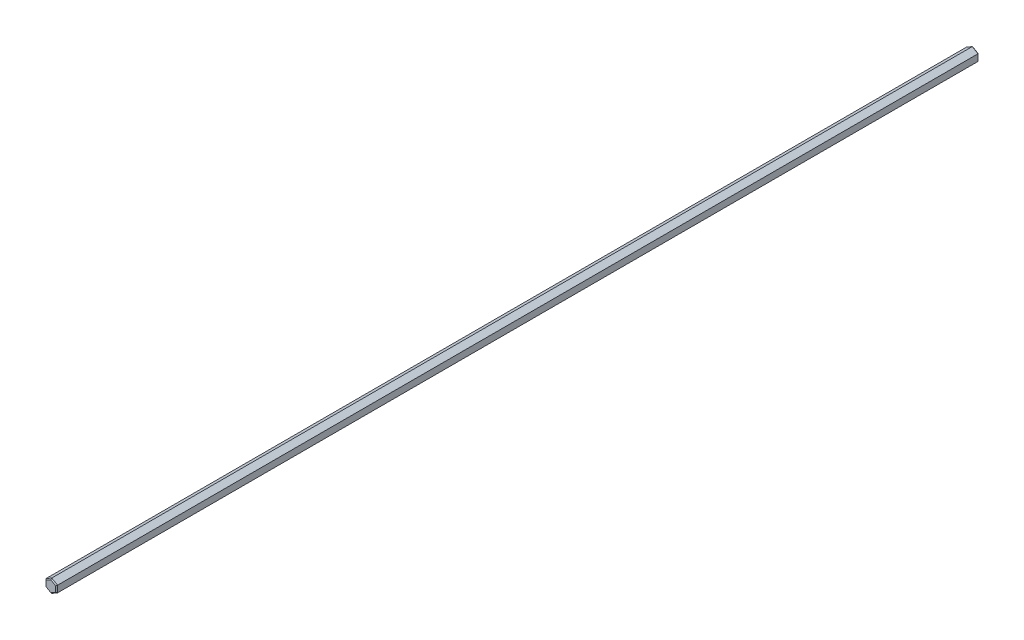
ISO-10303-21;
HEADER;
FILE_DESCRIPTION(('STEP AP214'),'2;1');
FILE_NAME('part.step','',(''),(''),'','','');
FILE_SCHEMA(('AUTOMOTIVE_DESIGN { 1 0 10303 214 1 1 1 1 }'));
ENDSEC;
DATA;
#1=APPLICATION_CONTEXT('core data for automotive mechanical design processes');
#2=APPLICATION_PROTOCOL_DEFINITION('international standard','automotive_design',2000,#1);
#3=PRODUCT_CONTEXT('',#1,'mechanical');
#4=PRODUCT('Part','Part','',(#3));
#5=PRODUCT_RELATED_PRODUCT_CATEGORY('part','',(#4));
#6=PRODUCT_DEFINITION_FORMATION('','',#4);
#7=PRODUCT_DEFINITION_CONTEXT('part definition',#1,'design');
#8=PRODUCT_DEFINITION('design','',#6,#7);
#9=PRODUCT_DEFINITION_SHAPE('','',#8);
#10=(LENGTH_UNIT() NAMED_UNIT(*) SI_UNIT(.MILLI.,.METRE.));
#11=(NAMED_UNIT(*) PLANE_ANGLE_UNIT() SI_UNIT($,.RADIAN.));
#12=(NAMED_UNIT(*) SI_UNIT($,.STERADIAN.) SOLID_ANGLE_UNIT());
#13=UNCERTAINTY_MEASURE_WITH_UNIT(LENGTH_MEASURE(1.E-05),#10,'distance_accuracy_value','');
#14=(GEOMETRIC_REPRESENTATION_CONTEXT(3) GLOBAL_UNCERTAINTY_ASSIGNED_CONTEXT((#13)) GLOBAL_UNIT_ASSIGNED_CONTEXT((#10,
#11,#12)) REPRESENTATION_CONTEXT('',''));
#15=CARTESIAN_POINT('',(0.,0.,0.));
#16=DIRECTION('',(0.,0.,1.));
#17=DIRECTION('',(1.,0.,0.));
#18=AXIS2_PLACEMENT_3D('',#15,#16,#17);
#19=CARTESIAN_POINT('',(-2.5,-1.44337567297406,-44.9999999999999));
#20=DIRECTION('',(-0.5,-0.866025403784439,0.));
#21=DIRECTION('',(0.866025403784439,-0.5,0.));
#22=AXIS2_PLACEMENT_3D('',#19,#20,#21);
#23=PLANE('',#22);
#24=DIRECTION('',(0.,0.,1.));
#25=VECTOR('',#24,1.);
#26=CARTESIAN_POINT('',(-2.5,-1.44337567297406,-44.9999999999999));
#27=LINE('',#26,#25);
#28=CARTESIAN_POINT('',(-2.5,-1.44337567297406,-44.6));
#29=VERTEX_POINT('',#28);
#30=CARTESIAN_POINT('',(-2.5,-1.44337567297406,354.6));
#31=VERTEX_POINT('',#30);
#32=EDGE_CURVE('E149',#29,#31,#27,.T.);
#33=ORIENTED_EDGE('',*,*,#32,.F.);
#34=DIRECTION('',(0.866025403784439,-0.5,0.));
#35=VECTOR('',#34,1.);
#36=CARTESIAN_POINT('',(0.,-2.88675134594813,-44.6));
#37=LINE('',#36,#35);
#38=CARTESIAN_POINT('',(0.,-2.88675134594813,-44.6));
#39=VERTEX_POINT('',#38);
#40=EDGE_CURVE('E181',#29,#39,#37,.T.);
#41=ORIENTED_EDGE('',*,*,#40,.T.);
#42=DIRECTION('',(0.,0.,1.));
#43=VECTOR('',#42,1.);
#44=CARTESIAN_POINT('',(0.,-2.88675134594813,-44.9999999999999));
#45=LINE('',#44,#43);
#46=CARTESIAN_POINT('',(0.,-2.88675134594813,354.6));
#47=VERTEX_POINT('',#46);
#48=EDGE_CURVE('E215',#39,#47,#45,.T.);
#49=ORIENTED_EDGE('',*,*,#48,.T.);
#50=DIRECTION('',(-0.866025403784439,0.5,0.));
#51=VECTOR('',#50,1.);
#52=CARTESIAN_POINT('',(-2.5,-1.44337567297406,354.6));
#53=LINE('',#52,#51);
#54=EDGE_CURVE('E137',#47,#31,#53,.T.);
#55=ORIENTED_EDGE('',*,*,#54,.T.);
#56=EDGE_LOOP('',(#33,#41,#49,#55));
#57=FACE_BOUND('',#56,.T.);
#58=ADVANCED_FACE('F33',(#57),#23,.T.);
#59=CARTESIAN_POINT('',(-2.5,1.44337567297407,-44.9999999999999));
#60=DIRECTION('',(-1.,0.,0.));
#61=DIRECTION('',(0.,0.,1.));
#62=AXIS2_PLACEMENT_3D('',#59,#60,#61);
#63=PLANE('',#62);
#64=DIRECTION('',(0.,0.,1.));
#65=VECTOR('',#64,1.);
#66=CARTESIAN_POINT('',(-2.5,1.44337567297407,-44.9999999999999));
#67=LINE('',#66,#65);
#68=CARTESIAN_POINT('',(-2.5,1.44337567297407,-44.6));
#69=VERTEX_POINT('',#68);
#70=CARTESIAN_POINT('',(-2.5,1.44337567297407,354.6));
#71=VERTEX_POINT('',#70);
#72=EDGE_CURVE('E130',#69,#71,#67,.T.);
#73=ORIENTED_EDGE('',*,*,#72,.F.);
#74=DIRECTION('',(0.,-1.,0.));
#75=VECTOR('',#74,1.);
#76=CARTESIAN_POINT('',(-2.5,-1.44337567297406,-44.6));
#77=LINE('',#76,#75);
#78=EDGE_CURVE('E145',#69,#29,#77,.T.);
#79=ORIENTED_EDGE('',*,*,#78,.T.);
#80=ORIENTED_EDGE('',*,*,#32,.T.);
#81=DIRECTION('',(0.,1.,0.));
#82=VECTOR('',#81,1.);
#83=CARTESIAN_POINT('',(-2.5,1.44337567297407,354.6));
#84=LINE('',#83,#82);
#85=EDGE_CURVE('E148',#31,#71,#84,.T.);
#86=ORIENTED_EDGE('',*,*,#85,.T.);
#87=EDGE_LOOP('',(#73,#79,#80,#86));
#88=FACE_BOUND('',#87,.T.);
#89=ADVANCED_FACE('F142',(#88),#63,.T.);
#90=CARTESIAN_POINT('',(0.,2.88675134594813,-44.9999999999999));
#91=DIRECTION('',(-0.5,0.866025403784439,0.));
#92=DIRECTION('',(-0.866025403784439,-0.5,0.));
#93=AXIS2_PLACEMENT_3D('',#90,#91,#92);
#94=PLANE('',#93);
#95=DIRECTION('',(0.,0.,1.));
#96=VECTOR('',#95,1.);
#97=CARTESIAN_POINT('',(0.,2.88675134594813,-44.9999999999999));
#98=LINE('',#97,#96);
#99=CARTESIAN_POINT('',(0.,2.88675134594813,-44.6));
#100=VERTEX_POINT('',#99);
#101=CARTESIAN_POINT('',(0.,2.88675134594813,354.6));
#102=VERTEX_POINT('',#101);
#103=EDGE_CURVE('E132',#100,#102,#98,.T.);
#104=ORIENTED_EDGE('',*,*,#103,.F.);
#105=DIRECTION('',(-0.866025403784439,-0.5,0.));
#106=VECTOR('',#105,1.);
#107=CARTESIAN_POINT('',(-2.5,1.44337567297407,-44.6));
#108=LINE('',#107,#106);
#109=EDGE_CURVE('E126',#100,#69,#108,.T.);
#110=ORIENTED_EDGE('',*,*,#109,.T.);
#111=ORIENTED_EDGE('',*,*,#72,.T.);
#112=DIRECTION('',(0.866025403784439,0.5,0.));
#113=VECTOR('',#112,1.);
#114=CARTESIAN_POINT('',(0.,2.88675134594813,354.6));
#115=LINE('',#114,#113);
#116=EDGE_CURVE('E138',#71,#102,#115,.T.);
#117=ORIENTED_EDGE('',*,*,#116,.T.);
#118=EDGE_LOOP('',(#104,#110,#111,#117));
#119=FACE_BOUND('',#118,.T.);
#120=ADVANCED_FACE('F128',(#119),#94,.T.);
#121=CARTESIAN_POINT('',(2.5,1.44337567297406,-44.9999999999999));
#122=DIRECTION('',(0.5,0.866025403784439,0.));
#123=DIRECTION('',(-0.866025403784439,0.5,0.));
#124=AXIS2_PLACEMENT_3D('',#121,#122,#123);
#125=PLANE('',#124);
#126=DIRECTION('',(0.,0.,1.));
#127=VECTOR('',#126,1.);
#128=CARTESIAN_POINT('',(2.5,1.44337567297406,-44.9999999999999));
#129=LINE('',#128,#127);
#130=CARTESIAN_POINT('',(2.5,1.44337567297406,-44.6));
#131=VERTEX_POINT('',#130);
#132=CARTESIAN_POINT('',(2.5,1.44337567297406,354.6));
#133=VERTEX_POINT('',#132);
#134=EDGE_CURVE('E249',#131,#133,#129,.T.);
#135=ORIENTED_EDGE('',*,*,#134,.F.);
#136=DIRECTION('',(-0.866025403784439,0.5,0.));
#137=VECTOR('',#136,1.);
#138=CARTESIAN_POINT('',(0.,2.88675134594813,-44.6));
#139=LINE('',#138,#137);
#140=EDGE_CURVE('E185',#131,#100,#139,.T.);
#141=ORIENTED_EDGE('',*,*,#140,.T.);
#142=ORIENTED_EDGE('',*,*,#103,.T.);
#143=DIRECTION('',(0.866025403784439,-0.5,0.));
#144=VECTOR('',#143,1.);
#145=CARTESIAN_POINT('',(2.5,1.44337567297406,354.6));
#146=LINE('',#145,#144);
#147=EDGE_CURVE('E183',#102,#133,#146,.T.);
#148=ORIENTED_EDGE('',*,*,#147,.T.);
#149=EDGE_LOOP('',(#135,#141,#142,#148));
#150=FACE_BOUND('',#149,.T.);
#151=ADVANCED_FACE('F266',(#150),#125,.T.);
#152=CARTESIAN_POINT('',(2.5,-1.44337567297407,-44.9999999999999));
#153=DIRECTION('',(1.,0.,0.));
#154=DIRECTION('',(0.,0.,-1.));
#155=AXIS2_PLACEMENT_3D('',#152,#153,#154);
#156=PLANE('',#155);
#157=DIRECTION('',(0.,0.,1.));
#158=VECTOR('',#157,1.);
#159=CARTESIAN_POINT('',(2.5,-1.44337567297407,-44.9999999999999));
#160=LINE('',#159,#158);
#161=CARTESIAN_POINT('',(2.5,-1.44337567297407,-44.6));
#162=VERTEX_POINT('',#161);
#163=CARTESIAN_POINT('',(2.5,-1.44337567297407,354.6));
#164=VERTEX_POINT('',#163);
#165=EDGE_CURVE('E247',#162,#164,#160,.T.);
#166=ORIENTED_EDGE('',*,*,#165,.F.);
#167=DIRECTION('',(0.,1.,0.));
#168=VECTOR('',#167,1.);
#169=CARTESIAN_POINT('',(2.5,1.44337567297406,-44.6));
#170=LINE('',#169,#168);
#171=EDGE_CURVE('E193',#162,#131,#170,.T.);
#172=ORIENTED_EDGE('',*,*,#171,.T.);
#173=ORIENTED_EDGE('',*,*,#134,.T.);
#174=DIRECTION('',(0.,-1.,0.));
#175=VECTOR('',#174,1.);
#176=CARTESIAN_POINT('',(2.5,-1.44337567297407,354.6));
#177=LINE('',#176,#175);
#178=EDGE_CURVE('E191',#133,#164,#177,.T.);
#179=ORIENTED_EDGE('',*,*,#178,.T.);
#180=EDGE_LOOP('',(#166,#172,#173,#179));
#181=FACE_BOUND('',#180,.T.);
#182=ADVANCED_FACE('F303',(#181),#156,.T.);
#183=CARTESIAN_POINT('',(0.,-2.88675134594813,-44.9999999999999));
#184=DIRECTION('',(0.5,-0.866025403784439,0.));
#185=DIRECTION('',(0.866025403784439,0.5,0.));
#186=AXIS2_PLACEMENT_3D('',#183,#184,#185);
#187=PLANE('',#186);
#188=ORIENTED_EDGE('',*,*,#48,.F.);
#189=DIRECTION('',(0.866025403784439,0.5,0.));
#190=VECTOR('',#189,1.);
#191=CARTESIAN_POINT('',(2.5,-1.44337567297407,-44.6));
#192=LINE('',#191,#190);
#193=EDGE_CURVE('E189',#39,#162,#192,.T.);
#194=ORIENTED_EDGE('',*,*,#193,.T.);
#195=ORIENTED_EDGE('',*,*,#165,.T.);
#196=DIRECTION('',(-0.866025403784439,-0.5,0.));
#197=VECTOR('',#196,1.);
#198=CARTESIAN_POINT('',(0.,-2.88675134594813,354.6));
#199=LINE('',#198,#197);
#200=EDGE_CURVE('E187',#164,#47,#199,.T.);
#201=ORIENTED_EDGE('',*,*,#200,.T.);
#202=EDGE_LOOP('',(#188,#194,#195,#201));
#203=FACE_BOUND('',#202,.T.);
#204=ADVANCED_FACE('F244',(#203),#187,.T.);
#205=CARTESIAN_POINT('',(0.,0.,-44.9999999999999));
#206=DIRECTION('',(0.,0.,1.));
#207=DIRECTION('',(1.,0.,0.));
#208=AXIS2_PLACEMENT_3D('',#205,#206,#207);
#209=PLANE('',#208);
#210=DIRECTION('',(-0.866025403784439,0.5,0.));
#211=VECTOR('',#210,1.);
#212=CARTESIAN_POINT('',(-2.30000000000005,-1.09696551146037,-44.9999999999999));
#213=LINE('',#212,#211);
#214=CARTESIAN_POINT('',(0.,-2.42487113059654,-44.9999999999999));
#215=VERTEX_POINT('',#214);
#216=CARTESIAN_POINT('',(-2.1000000000001,-1.21243556529827,-44.9999999999999));
#217=VERTEX_POINT('',#216);
#218=EDGE_CURVE('E174',#215,#217,#213,.T.);
#219=ORIENTED_EDGE('',*,*,#218,.T.);
#220=DIRECTION('',(0.,1.,0.));
#221=VECTOR('',#220,1.);
#222=CARTESIAN_POINT('',(-2.1000000000001,1.44337567297407,-44.9999999999999));
#223=LINE('',#222,#221);
#224=CARTESIAN_POINT('',(-2.1000000000001,1.21243556529827,-44.9999999999999));
#225=VERTEX_POINT('',#224);
#226=EDGE_CURVE('E177',#217,#225,#223,.T.);
#227=ORIENTED_EDGE('',*,*,#226,.T.);
#228=DIRECTION('',(0.866025403784439,0.5,0.));
#229=VECTOR('',#228,1.);
#230=CARTESIAN_POINT('',(0.199999999999945,2.54034118443444,-44.9999999999999));
#231=LINE('',#230,#229);
#232=CARTESIAN_POINT('',(0.,2.42487113059654,-44.9999999999999));
#233=VERTEX_POINT('',#232);
#234=EDGE_CURVE('E154',#225,#233,#231,.T.);
#235=ORIENTED_EDGE('',*,*,#234,.T.);
#236=DIRECTION('',(0.866025403784439,-0.5,0.));
#237=VECTOR('',#236,1.);
#238=CARTESIAN_POINT('',(2.30000000000005,1.09696551146037,-44.9999999999999));
#239=LINE('',#238,#237);
#240=CARTESIAN_POINT('',(2.1000000000001,1.21243556529827,-44.9999999999999));
#241=VERTEX_POINT('',#240);
#242=EDGE_CURVE('E172',#233,#241,#239,.T.);
#243=ORIENTED_EDGE('',*,*,#242,.T.);
#244=DIRECTION('',(0.,-1.,0.));
#245=VECTOR('',#244,1.);
#246=CARTESIAN_POINT('',(2.1000000000001,-1.44337567297407,-44.9999999999999));
#247=LINE('',#246,#245);
#248=CARTESIAN_POINT('',(2.1000000000001,-1.21243556529827,-44.9999999999999));
#249=VERTEX_POINT('',#248);
#250=EDGE_CURVE('E164',#241,#249,#247,.T.);
#251=ORIENTED_EDGE('',*,*,#250,.T.);
#252=DIRECTION('',(-0.866025403784439,-0.5,0.));
#253=VECTOR('',#252,1.);
#254=CARTESIAN_POINT('',(-0.199999999999946,-2.54034118443444,-44.9999999999999));
#255=LINE('',#254,#253);
#256=EDGE_CURVE('E166',#249,#215,#255,.T.);
#257=ORIENTED_EDGE('',*,*,#256,.T.);
#258=EDGE_LOOP('',(#219,#227,#235,#243,#251,#257));
#259=FACE_BOUND('',#258,.T.);
#260=ADVANCED_FACE('F274',(#259),#209,.F.);
#261=CARTESIAN_POINT('',(0.,0.,355.));
#262=DIRECTION('',(0.,0.,1.));
#263=DIRECTION('',(1.,0.,0.));
#264=AXIS2_PLACEMENT_3D('',#261,#262,#263);
#265=PLANE('',#264);
#266=DIRECTION('',(-0.866025403784439,0.5,0.));
#267=VECTOR('',#266,1.);
#268=CARTESIAN_POINT('',(1.05000000000002,1.81865334794735,355.));
#269=LINE('',#268,#267);
#270=CARTESIAN_POINT('',(2.10000000000004,1.21243556529823,355.));
#271=VERTEX_POINT('',#270);
#272=CARTESIAN_POINT('',(0.,2.42487113059648,355.));
#273=VERTEX_POINT('',#272);
#274=EDGE_CURVE('E42',#271,#273,#269,.T.);
#275=ORIENTED_EDGE('',*,*,#274,.T.);
#276=DIRECTION('',(-0.866025403784439,-0.5,0.));
#277=VECTOR('',#276,1.);
#278=CARTESIAN_POINT('',(-1.05000000000002,1.81865334794736,355.));
#279=LINE('',#278,#277);
#280=CARTESIAN_POINT('',(-2.10000000000004,1.21243556529824,355.));
#281=VERTEX_POINT('',#280);
#282=EDGE_CURVE('E11',#273,#281,#279,.T.);
#283=ORIENTED_EDGE('',*,*,#282,.T.);
#284=DIRECTION('',(0.,-1.,0.));
#285=VECTOR('',#284,1.);
#286=CARTESIAN_POINT('',(-2.10000000000004,0.,355.));
#287=LINE('',#286,#285);
#288=CARTESIAN_POINT('',(-2.10000000000004,-1.21243556529823,355.));
#289=VERTEX_POINT('',#288);
#290=EDGE_CURVE('E201',#281,#289,#287,.T.);
#291=ORIENTED_EDGE('',*,*,#290,.T.);
#292=DIRECTION('',(0.866025403784439,-0.5,0.));
#293=VECTOR('',#292,1.);
#294=CARTESIAN_POINT('',(-1.05000000000002,-1.81865334794736,355.));
#295=LINE('',#294,#293);
#296=CARTESIAN_POINT('',(0.,-2.42487113059648,355.));
#297=VERTEX_POINT('',#296);
#298=EDGE_CURVE('E197',#289,#297,#295,.T.);
#299=ORIENTED_EDGE('',*,*,#298,.T.);
#300=DIRECTION('',(0.866025403784439,0.5,0.));
#301=VECTOR('',#300,1.);
#302=CARTESIAN_POINT('',(1.05000000000002,-1.81865334794736,355.));
#303=LINE('',#302,#301);
#304=CARTESIAN_POINT('',(2.10000000000004,-1.21243556529824,355.));
#305=VERTEX_POINT('',#304);
#306=EDGE_CURVE('E195',#297,#305,#303,.T.);
#307=ORIENTED_EDGE('',*,*,#306,.T.);
#308=DIRECTION('',(0.,1.,0.));
#309=VECTOR('',#308,1.);
#310=CARTESIAN_POINT('',(2.10000000000004,0.,355.));
#311=LINE('',#310,#309);
#312=EDGE_CURVE('E199',#305,#271,#311,.T.);
#313=ORIENTED_EDGE('',*,*,#312,.T.);
#314=EDGE_LOOP('',(#275,#283,#291,#299,#307,#313));
#315=FACE_BOUND('',#314,.T.);
#316=ADVANCED_FACE('F259',(#315),#265,.T.);
#317=CARTESIAN_POINT('',(2.5,-1.44337567297407,-44.6));
#318=DIRECTION('',(0.707106781186548,0.,-0.707106781186548));
#319=DIRECTION('',(0.,-1.,0.));
#320=AXIS2_PLACEMENT_3D('',#317,#318,#319);
#321=PLANE('',#320);
#322=DIRECTION('',(-0.654653670707977,0.377964473009227,-0.654653670707977));
#323=VECTOR('',#322,1.);
#324=CARTESIAN_POINT('',(2.5,-1.44337567297407,-44.6));
#325=LINE('',#324,#323);
#326=EDGE_CURVE('E209',#249,#162,#325,.F.);
#327=ORIENTED_EDGE('',*,*,#326,.F.);
#328=ORIENTED_EDGE('',*,*,#250,.F.);
#329=DIRECTION('',(0.654653670707977,0.377964473009227,0.654653670707977));
#330=VECTOR('',#329,1.);
#331=CARTESIAN_POINT('',(1.78571428571429,1.0309826235529,-45.3142857142857));
#332=LINE('',#331,#330);
#333=EDGE_CURVE('E212',#131,#241,#332,.F.);
#334=ORIENTED_EDGE('',*,*,#333,.F.);
#335=ORIENTED_EDGE('',*,*,#171,.F.);
#336=EDGE_LOOP('',(#327,#328,#334,#335));
#337=FACE_BOUND('',#336,.T.);
#338=ADVANCED_FACE('F277',(#337),#321,.T.);
#339=CARTESIAN_POINT('',(2.5,1.44337567297406,-44.6));
#340=DIRECTION('',(0.353553390593274,0.612372435695794,-0.707106781186548));
#341=DIRECTION('',(0.866025403784439,-0.5,0.));
#342=AXIS2_PLACEMENT_3D('',#339,#340,#341);
#343=PLANE('',#342);
#344=ORIENTED_EDGE('',*,*,#333,.T.);
#345=ORIENTED_EDGE('',*,*,#242,.F.);
#346=DIRECTION('',(0.,0.755928946018455,0.654653670707977));
#347=VECTOR('',#346,1.);
#348=CARTESIAN_POINT('',(0.,2.0619652471058,-45.3142857142857));
#349=LINE('',#348,#347);
#350=EDGE_CURVE('E207',#100,#233,#349,.F.);
#351=ORIENTED_EDGE('',*,*,#350,.F.);
#352=ORIENTED_EDGE('',*,*,#140,.F.);
#353=EDGE_LOOP('',(#344,#345,#351,#352));
#354=FACE_BOUND('',#353,.T.);
#355=ADVANCED_FACE('F270',(#354),#343,.T.);
#356=CARTESIAN_POINT('',(0.,-2.88675134594813,-44.6));
#357=DIRECTION('',(0.353553390593274,-0.612372435695795,-0.707106781186547));
#358=DIRECTION('',(-0.866025403784439,-0.5,0.));
#359=AXIS2_PLACEMENT_3D('',#356,#357,#358);
#360=PLANE('',#359);
#361=ORIENTED_EDGE('',*,*,#326,.T.);
#362=ORIENTED_EDGE('',*,*,#193,.F.);
#363=DIRECTION('',(0.,0.755928946018455,-0.654653670707977));
#364=VECTOR('',#363,1.);
#365=CARTESIAN_POINT('',(0.,-2.88675134594813,-44.6));
#366=LINE('',#365,#364);
#367=EDGE_CURVE('E158',#215,#39,#366,.F.);
#368=ORIENTED_EDGE('',*,*,#367,.F.);
#369=ORIENTED_EDGE('',*,*,#256,.F.);
#370=EDGE_LOOP('',(#361,#362,#368,#369));
#371=FACE_BOUND('',#370,.T.);
#372=ADVANCED_FACE('F282',(#371),#360,.T.);
#373=CARTESIAN_POINT('',(0.,2.88675134594813,-44.6));
#374=DIRECTION('',(-0.353553390593274,0.612372435695794,-0.707106781186548));
#375=DIRECTION('',(0.866025403784439,0.5,0.));
#376=AXIS2_PLACEMENT_3D('',#373,#374,#375);
#377=PLANE('',#376);
#378=ORIENTED_EDGE('',*,*,#350,.T.);
#379=ORIENTED_EDGE('',*,*,#234,.F.);
#380=DIRECTION('',(-0.654653670707977,0.377964473009228,0.654653670707977));
#381=VECTOR('',#380,1.);
#382=CARTESIAN_POINT('',(-1.78571428571429,1.03098262355291,-45.3142857142857));
#383=LINE('',#382,#381);
#384=EDGE_CURVE('E152',#69,#225,#383,.F.);
#385=ORIENTED_EDGE('',*,*,#384,.F.);
#386=ORIENTED_EDGE('',*,*,#109,.F.);
#387=EDGE_LOOP('',(#378,#379,#385,#386));
#388=FACE_BOUND('',#387,.T.);
#389=ADVANCED_FACE('F153',(#388),#377,.T.);
#390=CARTESIAN_POINT('',(-2.5,-1.44337567297406,-44.6));
#391=DIRECTION('',(-0.353553390593273,-0.612372435695794,-0.707106781186548));
#392=DIRECTION('',(-0.866025403784439,0.5,0.));
#393=AXIS2_PLACEMENT_3D('',#390,#391,#392);
#394=PLANE('',#393);
#395=ORIENTED_EDGE('',*,*,#367,.T.);
#396=ORIENTED_EDGE('',*,*,#40,.F.);
#397=DIRECTION('',(0.654653670707977,0.377964473009228,-0.654653670707977));
#398=VECTOR('',#397,1.);
#399=CARTESIAN_POINT('',(-2.5,-1.44337567297406,-44.6));
#400=LINE('',#399,#398);
#401=EDGE_CURVE('E159',#217,#29,#400,.F.);
#402=ORIENTED_EDGE('',*,*,#401,.F.);
#403=ORIENTED_EDGE('',*,*,#218,.F.);
#404=EDGE_LOOP('',(#395,#396,#402,#403));
#405=FACE_BOUND('',#404,.T.);
#406=ADVANCED_FACE('F285',(#405),#394,.T.);
#407=CARTESIAN_POINT('',(-2.5,1.44337567297407,-44.6));
#408=DIRECTION('',(-0.707106781186548,0.,-0.707106781186548));
#409=DIRECTION('',(0.,1.,0.));
#410=AXIS2_PLACEMENT_3D('',#407,#408,#409);
#411=PLANE('',#410);
#412=ORIENTED_EDGE('',*,*,#384,.T.);
#413=ORIENTED_EDGE('',*,*,#226,.F.);
#414=ORIENTED_EDGE('',*,*,#401,.T.);
#415=ORIENTED_EDGE('',*,*,#78,.F.);
#416=EDGE_LOOP('',(#412,#413,#414,#415));
#417=FACE_BOUND('',#416,.T.);
#418=ADVANCED_FACE('F161',(#417),#411,.T.);
#419=CARTESIAN_POINT('',(1.05000000000002,-1.81865334794736,355.));
#420=DIRECTION('',(-0.353553390593273,0.612372435695794,-0.707106781186549));
#421=DIRECTION('',(0.866025403784439,0.5,0.));
#422=AXIS2_PLACEMENT_3D('',#419,#420,#421);
#423=PLANE('',#422);
#424=DIRECTION('',(0.,-0.755928946018455,-0.654653670707976));
#425=VECTOR('',#424,1.);
#426=CARTESIAN_POINT('',(0.,-2.07846096908269,355.3));
#427=LINE('',#426,#425);
#428=EDGE_CURVE('E224',#47,#297,#427,.F.);
#429=ORIENTED_EDGE('',*,*,#428,.F.);
#430=ORIENTED_EDGE('',*,*,#200,.F.);
#431=DIRECTION('',(-0.654653670707977,0.377964473009228,0.654653670707976));
#432=VECTOR('',#431,1.);
#433=CARTESIAN_POINT('',(1.80000000000004,-1.03923048454135,355.3));
#434=LINE('',#433,#432);
#435=EDGE_CURVE('E37',#305,#164,#434,.F.);
#436=ORIENTED_EDGE('',*,*,#435,.F.);
#437=ORIENTED_EDGE('',*,*,#306,.F.);
#438=EDGE_LOOP('',(#429,#430,#436,#437));
#439=FACE_BOUND('',#438,.T.);
#440=ADVANCED_FACE('F35',(#439),#423,.F.);
#441=CARTESIAN_POINT('',(2.10000000000004,0.,355.));
#442=DIRECTION('',(-0.707106781186547,0.,-0.707106781186548));
#443=DIRECTION('',(0.,1.,0.));
#444=AXIS2_PLACEMENT_3D('',#441,#442,#443);
#445=PLANE('',#444);
#446=ORIENTED_EDGE('',*,*,#435,.T.);
#447=ORIENTED_EDGE('',*,*,#178,.F.);
#448=DIRECTION('',(-0.654653670707978,-0.377964473009228,0.654653670707976));
#449=VECTOR('',#448,1.);
#450=CARTESIAN_POINT('',(1.80000000000004,1.03923048454134,355.3));
#451=LINE('',#450,#449);
#452=EDGE_CURVE('E222',#271,#133,#451,.F.);
#453=ORIENTED_EDGE('',*,*,#452,.F.);
#454=ORIENTED_EDGE('',*,*,#312,.F.);
#455=EDGE_LOOP('',(#446,#447,#453,#454));
#456=FACE_BOUND('',#455,.T.);
#457=ADVANCED_FACE('F235',(#456),#445,.F.);
#458=CARTESIAN_POINT('',(-1.05000000000002,-1.81865334794736,355.));
#459=DIRECTION('',(0.353553390593273,0.612372435695794,-0.707106781186548));
#460=DIRECTION('',(0.866025403784439,-0.5,0.));
#461=AXIS2_PLACEMENT_3D('',#458,#459,#460);
#462=PLANE('',#461);
#463=ORIENTED_EDGE('',*,*,#428,.T.);
#464=ORIENTED_EDGE('',*,*,#298,.F.);
#465=DIRECTION('',(-0.654653670707978,-0.377964473009228,-0.654653670707976));
#466=VECTOR('',#465,1.);
#467=CARTESIAN_POINT('',(-1.80000000000004,-1.03923048454134,355.3));
#468=LINE('',#467,#466);
#469=EDGE_CURVE('E219',#31,#289,#468,.F.);
#470=ORIENTED_EDGE('',*,*,#469,.F.);
#471=ORIENTED_EDGE('',*,*,#54,.F.);
#472=EDGE_LOOP('',(#463,#464,#470,#471));
#473=FACE_BOUND('',#472,.T.);
#474=ADVANCED_FACE('F256',(#473),#462,.F.);
#475=CARTESIAN_POINT('',(1.05000000000002,1.81865334794736,355.));
#476=DIRECTION('',(-0.353553390593273,-0.612372435695794,-0.707106781186548));
#477=DIRECTION('',(-0.866025403784439,0.5,0.));
#478=AXIS2_PLACEMENT_3D('',#475,#476,#477);
#479=PLANE('',#478);
#480=ORIENTED_EDGE('',*,*,#452,.T.);
#481=ORIENTED_EDGE('',*,*,#147,.F.);
#482=DIRECTION('',(0.,-0.755928946018455,0.654653670707976));
#483=VECTOR('',#482,1.);
#484=CARTESIAN_POINT('',(0.,2.07846096908269,355.3));
#485=LINE('',#484,#483);
#486=EDGE_CURVE('E217',#273,#102,#485,.F.);
#487=ORIENTED_EDGE('',*,*,#486,.F.);
#488=ORIENTED_EDGE('',*,*,#274,.F.);
#489=EDGE_LOOP('',(#480,#481,#487,#488));
#490=FACE_BOUND('',#489,.T.);
#491=ADVANCED_FACE('F263',(#490),#479,.F.);
#492=CARTESIAN_POINT('',(-2.10000000000004,0.,355.));
#493=DIRECTION('',(0.707106781186547,0.,-0.707106781186548));
#494=DIRECTION('',(0.,-1.,0.));
#495=AXIS2_PLACEMENT_3D('',#492,#493,#494);
#496=PLANE('',#495);
#497=ORIENTED_EDGE('',*,*,#469,.T.);
#498=ORIENTED_EDGE('',*,*,#290,.F.);
#499=DIRECTION('',(-0.654653670707978,0.377964473009228,-0.654653670707976));
#500=VECTOR('',#499,1.);
#501=CARTESIAN_POINT('',(-1.80000000000004,1.03923048454135,355.3));
#502=LINE('',#501,#500);
#503=EDGE_CURVE('E56',#71,#281,#502,.F.);
#504=ORIENTED_EDGE('',*,*,#503,.F.);
#505=ORIENTED_EDGE('',*,*,#85,.F.);
#506=EDGE_LOOP('',(#497,#498,#504,#505));
#507=FACE_BOUND('',#506,.T.);
#508=ADVANCED_FACE('F258',(#507),#496,.F.);
#509=CARTESIAN_POINT('',(-1.05000000000002,1.81865334794736,355.));
#510=DIRECTION('',(0.353553390593273,-0.612372435695794,-0.707106781186549));
#511=DIRECTION('',(-0.866025403784439,-0.5,0.));
#512=AXIS2_PLACEMENT_3D('',#509,#510,#511);
#513=PLANE('',#512);
#514=ORIENTED_EDGE('',*,*,#486,.T.);
#515=ORIENTED_EDGE('',*,*,#116,.F.);
#516=ORIENTED_EDGE('',*,*,#503,.T.);
#517=ORIENTED_EDGE('',*,*,#282,.F.);
#518=EDGE_LOOP('',(#514,#515,#516,#517));
#519=FACE_BOUND('',#518,.T.);
#520=ADVANCED_FACE('F260',(#519),#513,.F.);
#521=CLOSED_SHELL('',(#58,#89,#120,#151,#182,#204,#260,#316,#338,#355,#372,#389,#406,#418,#440,
#457,#474,#491,#508,#520));
#522=MANIFOLD_SOLID_BREP('B2',#521);
#523=ADVANCED_BREP_SHAPE_REPRESENTATION('',(#18,#522),#14);
#524=SHAPE_DEFINITION_REPRESENTATION(#9,#523);
ENDSEC;
END-ISO-10303-21;
